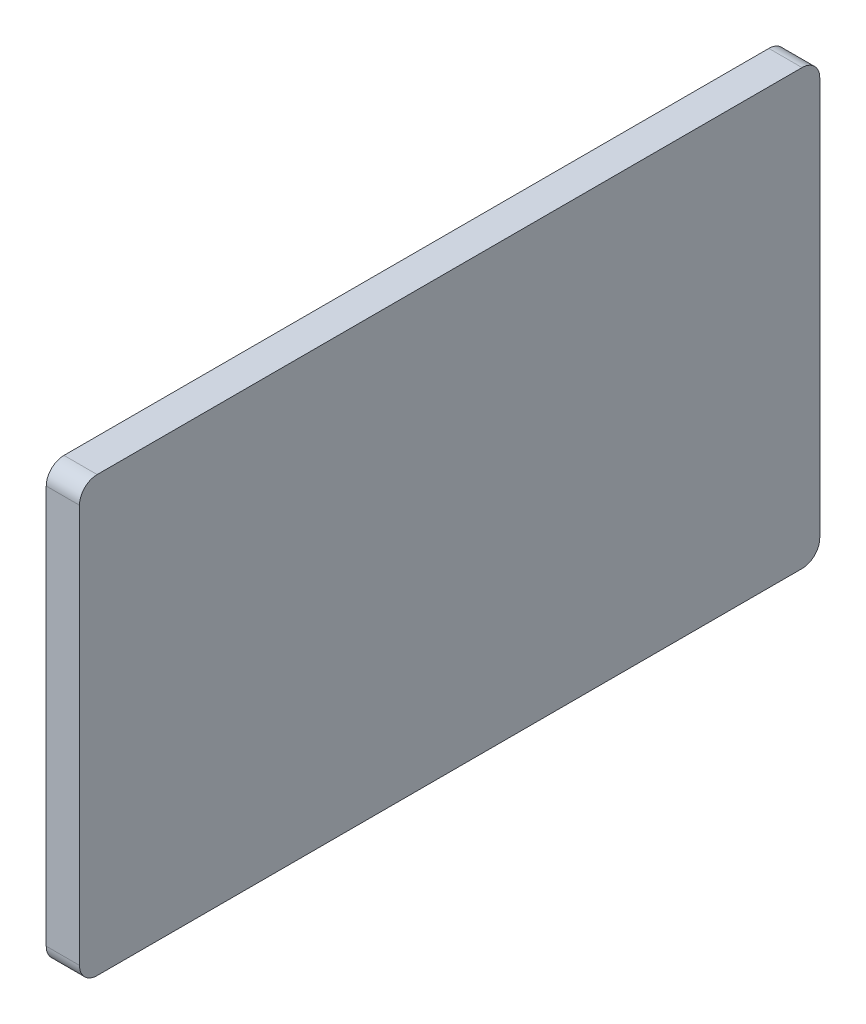
ISO-10303-21;
HEADER;
FILE_DESCRIPTION(('STEP AP214'),'2;1');
FILE_NAME('part.step','',(''),(''),'','','');
FILE_SCHEMA(('AUTOMOTIVE_DESIGN { 1 0 10303 214 1 1 1 1 }'));
ENDSEC;
DATA;
#1=APPLICATION_CONTEXT('core data for automotive mechanical design processes');
#2=APPLICATION_PROTOCOL_DEFINITION('international standard','automotive_design',2000,#1);
#3=PRODUCT_CONTEXT('',#1,'mechanical');
#4=PRODUCT('Part','Part','',(#3));
#5=PRODUCT_RELATED_PRODUCT_CATEGORY('part','',(#4));
#6=PRODUCT_DEFINITION_FORMATION('','',#4);
#7=PRODUCT_DEFINITION_CONTEXT('part definition',#1,'design');
#8=PRODUCT_DEFINITION('design','',#6,#7);
#9=PRODUCT_DEFINITION_SHAPE('','',#8);
#10=(LENGTH_UNIT() NAMED_UNIT(*) SI_UNIT(.MILLI.,.METRE.));
#11=(NAMED_UNIT(*) PLANE_ANGLE_UNIT() SI_UNIT($,.RADIAN.));
#12=(NAMED_UNIT(*) SI_UNIT($,.STERADIAN.) SOLID_ANGLE_UNIT());
#13=UNCERTAINTY_MEASURE_WITH_UNIT(LENGTH_MEASURE(1.E-05),#10,'distance_accuracy_value','');
#14=(GEOMETRIC_REPRESENTATION_CONTEXT(3) GLOBAL_UNCERTAINTY_ASSIGNED_CONTEXT((#13)) GLOBAL_UNIT_ASSIGNED_CONTEXT((#10,
#11,#12)) REPRESENTATION_CONTEXT('',''));
#15=CARTESIAN_POINT('',(0.,0.,0.));
#16=DIRECTION('',(0.,0.,1.));
#17=DIRECTION('',(1.,0.,0.));
#18=AXIS2_PLACEMENT_3D('',#15,#16,#17);
#19=CARTESIAN_POINT('',(9.525,-62.23,-106.172));
#20=DIRECTION('',(0.,0.,1.));
#21=DIRECTION('',(1.,0.,0.));
#22=AXIS2_PLACEMENT_3D('',#19,#20,#21);
#23=PLANE('',#22);
#24=DIRECTION('',(0.,1.,0.));
#25=VECTOR('',#24,1.);
#26=CARTESIAN_POINT('',(9.525,-62.23,-106.172));
#27=LINE('',#26,#25);
#28=CARTESIAN_POINT('',(9.525,-57.15,-106.172));
#29=VERTEX_POINT('',#28);
#30=CARTESIAN_POINT('',(9.525,57.15,-106.172));
#31=VERTEX_POINT('',#30);
#32=EDGE_CURVE('E131',#29,#31,#27,.T.);
#33=ORIENTED_EDGE('',*,*,#32,.F.);
#34=DIRECTION('',(-1.,0.,0.));
#35=VECTOR('',#34,1.);
#36=CARTESIAN_POINT('',(9.525,-57.15,-106.172));
#37=LINE('',#36,#35);
#38=CARTESIAN_POINT('',(0.,-57.15,-106.172));
#39=VERTEX_POINT('',#38);
#40=EDGE_CURVE('E115',#29,#39,#37,.T.);
#41=ORIENTED_EDGE('',*,*,#40,.T.);
#42=DIRECTION('',(0.,1.,0.));
#43=VECTOR('',#42,1.);
#44=CARTESIAN_POINT('',(0.,-62.23,-106.172));
#45=LINE('',#44,#43);
#46=CARTESIAN_POINT('',(0.,57.15,-106.172));
#47=VERTEX_POINT('',#46);
#48=EDGE_CURVE('E128',#39,#47,#45,.T.);
#49=ORIENTED_EDGE('',*,*,#48,.T.);
#50=DIRECTION('',(-1.,0.,0.));
#51=VECTOR('',#50,1.);
#52=CARTESIAN_POINT('',(9.525,57.15,-106.172));
#53=LINE('',#52,#51);
#54=EDGE_CURVE('E134',#47,#31,#53,.F.);
#55=ORIENTED_EDGE('',*,*,#54,.T.);
#56=EDGE_LOOP('',(#33,#41,#49,#55));
#57=FACE_BOUND('',#56,.T.);
#58=ADVANCED_FACE('F43',(#57),#23,.F.);
#59=CARTESIAN_POINT('',(9.525,62.23,106.172));
#60=DIRECTION('',(0.,-1.,0.));
#61=DIRECTION('',(0.,0.,-1.));
#62=AXIS2_PLACEMENT_3D('',#59,#60,#61);
#63=PLANE('',#62);
#64=DIRECTION('',(0.,0.,1.));
#65=VECTOR('',#64,1.);
#66=CARTESIAN_POINT('',(9.525,62.23,106.172));
#67=LINE('',#66,#65);
#68=CARTESIAN_POINT('',(9.525,62.23,-101.092));
#69=VERTEX_POINT('',#68);
#70=CARTESIAN_POINT('',(9.525,62.23,101.092));
#71=VERTEX_POINT('',#70);
#72=EDGE_CURVE('E189',#69,#71,#67,.T.);
#73=ORIENTED_EDGE('',*,*,#72,.F.);
#74=DIRECTION('',(-1.,0.,0.));
#75=VECTOR('',#74,1.);
#76=CARTESIAN_POINT('',(9.525,62.23,-101.092));
#77=LINE('',#76,#75);
#78=CARTESIAN_POINT('',(0.,62.23,-101.092));
#79=VERTEX_POINT('',#78);
#80=EDGE_CURVE('E11',#69,#79,#77,.T.);
#81=ORIENTED_EDGE('',*,*,#80,.T.);
#82=DIRECTION('',(0.,0.,1.));
#83=VECTOR('',#82,1.);
#84=CARTESIAN_POINT('',(0.,62.23,106.172));
#85=LINE('',#84,#83);
#86=CARTESIAN_POINT('',(0.,62.23,101.092));
#87=VERTEX_POINT('',#86);
#88=EDGE_CURVE('E140',#79,#87,#85,.T.);
#89=ORIENTED_EDGE('',*,*,#88,.T.);
#90=DIRECTION('',(-1.,0.,0.));
#91=VECTOR('',#90,1.);
#92=CARTESIAN_POINT('',(9.525,62.23,101.092));
#93=LINE('',#92,#91);
#94=EDGE_CURVE('E52',#87,#71,#93,.F.);
#95=ORIENTED_EDGE('',*,*,#94,.T.);
#96=EDGE_LOOP('',(#73,#81,#89,#95));
#97=FACE_BOUND('',#96,.T.);
#98=ADVANCED_FACE('F188',(#97),#63,.F.);
#99=CARTESIAN_POINT('',(9.525,-62.23,106.172));
#100=DIRECTION('',(0.,0.,-1.));
#101=DIRECTION('',(-1.,0.,0.));
#102=AXIS2_PLACEMENT_3D('',#99,#100,#101);
#103=PLANE('',#102);
#104=DIRECTION('',(0.,-1.,0.));
#105=VECTOR('',#104,1.);
#106=CARTESIAN_POINT('',(0.,-62.23,106.172));
#107=LINE('',#106,#105);
#108=CARTESIAN_POINT('',(0.,57.15,106.172));
#109=VERTEX_POINT('',#108);
#110=CARTESIAN_POINT('',(0.,-57.15,106.172));
#111=VERTEX_POINT('',#110);
#112=EDGE_CURVE('E144',#109,#111,#107,.T.);
#113=ORIENTED_EDGE('',*,*,#112,.T.);
#114=DIRECTION('',(-1.,0.,0.));
#115=VECTOR('',#114,1.);
#116=CARTESIAN_POINT('',(9.525,-57.15,106.172));
#117=LINE('',#116,#115);
#118=CARTESIAN_POINT('',(9.525,-57.15,106.172));
#119=VERTEX_POINT('',#118);
#120=EDGE_CURVE('E59',#111,#119,#117,.F.);
#121=ORIENTED_EDGE('',*,*,#120,.T.);
#122=DIRECTION('',(0.,-1.,0.));
#123=VECTOR('',#122,1.);
#124=CARTESIAN_POINT('',(9.525,-62.23,106.172));
#125=LINE('',#124,#123);
#126=CARTESIAN_POINT('',(9.525,57.15,106.172));
#127=VERTEX_POINT('',#126);
#128=EDGE_CURVE('E196',#127,#119,#125,.T.);
#129=ORIENTED_EDGE('',*,*,#128,.F.);
#130=DIRECTION('',(-1.,0.,0.));
#131=VECTOR('',#130,1.);
#132=CARTESIAN_POINT('',(9.525,57.15,106.172));
#133=LINE('',#132,#131);
#134=EDGE_CURVE('E179',#127,#109,#133,.T.);
#135=ORIENTED_EDGE('',*,*,#134,.T.);
#136=EDGE_LOOP('',(#113,#121,#129,#135));
#137=FACE_BOUND('',#136,.T.);
#138=ADVANCED_FACE('F200',(#137),#103,.F.);
#139=CARTESIAN_POINT('',(9.525,-62.23,106.172));
#140=DIRECTION('',(0.,1.,0.));
#141=DIRECTION('',(0.,0.,1.));
#142=AXIS2_PLACEMENT_3D('',#139,#140,#141);
#143=PLANE('',#142);
#144=DIRECTION('',(0.,0.,-1.));
#145=VECTOR('',#144,1.);
#146=CARTESIAN_POINT('',(0.,-62.23,106.172));
#147=LINE('',#146,#145);
#148=CARTESIAN_POINT('',(0.,-62.23,101.092));
#149=VERTEX_POINT('',#148);
#150=CARTESIAN_POINT('',(0.,-62.23,-101.092));
#151=VERTEX_POINT('',#150);
#152=EDGE_CURVE('E152',#149,#151,#147,.T.);
#153=ORIENTED_EDGE('',*,*,#152,.T.);
#154=DIRECTION('',(-1.,0.,0.));
#155=VECTOR('',#154,1.);
#156=CARTESIAN_POINT('',(9.525,-62.23,-101.092));
#157=LINE('',#156,#155);
#158=CARTESIAN_POINT('',(9.525,-62.23,-101.092));
#159=VERTEX_POINT('',#158);
#160=EDGE_CURVE('E116',#151,#159,#157,.F.);
#161=ORIENTED_EDGE('',*,*,#160,.T.);
#162=DIRECTION('',(0.,0.,-1.));
#163=VECTOR('',#162,1.);
#164=CARTESIAN_POINT('',(9.525,-62.23,106.172));
#165=LINE('',#164,#163);
#166=CARTESIAN_POINT('',(9.525,-62.23,101.092));
#167=VERTEX_POINT('',#166);
#168=EDGE_CURVE('E147',#167,#159,#165,.T.);
#169=ORIENTED_EDGE('',*,*,#168,.F.);
#170=DIRECTION('',(-1.,0.,0.));
#171=VECTOR('',#170,1.);
#172=CARTESIAN_POINT('',(9.525,-62.23,101.092));
#173=LINE('',#172,#171);
#174=EDGE_CURVE('E122',#167,#149,#173,.T.);
#175=ORIENTED_EDGE('',*,*,#174,.T.);
#176=EDGE_LOOP('',(#153,#161,#169,#175));
#177=FACE_BOUND('',#176,.T.);
#178=ADVANCED_FACE('F207',(#177),#143,.F.);
#179=CARTESIAN_POINT('',(9.525,0.,0.));
#180=DIRECTION('',(-1.,0.,0.));
#181=DIRECTION('',(0.,0.,1.));
#182=AXIS2_PLACEMENT_3D('',#179,#180,#181);
#183=PLANE('',#182);
#184=ORIENTED_EDGE('',*,*,#168,.T.);
#185=CARTESIAN_POINT('',(9.525,-57.15,-101.092));
#186=DIRECTION('',(-1.,0.,0.));
#187=DIRECTION('',(0.,0.,1.));
#188=AXIS2_PLACEMENT_3D('',#185,#186,#187);
#189=CIRCLE('',#188,5.08);
#190=EDGE_CURVE('E176',#159,#29,#189,.F.);
#191=ORIENTED_EDGE('',*,*,#190,.T.);
#192=ORIENTED_EDGE('',*,*,#32,.T.);
#193=CARTESIAN_POINT('',(9.525,57.15,-101.092));
#194=DIRECTION('',(-1.,0.,0.));
#195=DIRECTION('',(0.,0.,1.));
#196=AXIS2_PLACEMENT_3D('',#193,#194,#195);
#197=CIRCLE('',#196,5.08);
#198=EDGE_CURVE('E170',#31,#69,#197,.F.);
#199=ORIENTED_EDGE('',*,*,#198,.T.);
#200=ORIENTED_EDGE('',*,*,#72,.T.);
#201=CARTESIAN_POINT('',(9.525,57.15,101.092));
#202=DIRECTION('',(-1.,0.,0.));
#203=DIRECTION('',(0.,0.,1.));
#204=AXIS2_PLACEMENT_3D('',#201,#202,#203);
#205=CIRCLE('',#204,5.08);
#206=EDGE_CURVE('E66',#71,#127,#205,.F.);
#207=ORIENTED_EDGE('',*,*,#206,.T.);
#208=ORIENTED_EDGE('',*,*,#128,.T.);
#209=CARTESIAN_POINT('',(9.525,-57.15,101.092));
#210=DIRECTION('',(-1.,0.,0.));
#211=DIRECTION('',(0.,0.,1.));
#212=AXIS2_PLACEMENT_3D('',#209,#210,#211);
#213=CIRCLE('',#212,5.08);
#214=EDGE_CURVE('E173',#119,#167,#213,.F.);
#215=ORIENTED_EDGE('',*,*,#214,.T.);
#216=EDGE_LOOP('',(#184,#191,#192,#199,#200,#207,#208,#215));
#217=FACE_BOUND('',#216,.T.);
#218=ADVANCED_FACE('F193',(#217),#183,.F.);
#219=CARTESIAN_POINT('',(0.,0.,0.));
#220=DIRECTION('',(-1.,0.,0.));
#221=DIRECTION('',(0.,0.,1.));
#222=AXIS2_PLACEMENT_3D('',#219,#220,#221);
#223=PLANE('',#222);
#224=ORIENTED_EDGE('',*,*,#48,.F.);
#225=CARTESIAN_POINT('',(0.,-57.15,-101.092));
#226=DIRECTION('',(-1.,0.,0.));
#227=DIRECTION('',(0.,0.,1.));
#228=AXIS2_PLACEMENT_3D('',#225,#226,#227);
#229=CIRCLE('',#228,5.08);
#230=EDGE_CURVE('E111',#39,#151,#229,.T.);
#231=ORIENTED_EDGE('',*,*,#230,.T.);
#232=ORIENTED_EDGE('',*,*,#152,.F.);
#233=CARTESIAN_POINT('',(0.,-57.15,101.092));
#234=DIRECTION('',(-1.,0.,0.));
#235=DIRECTION('',(0.,0.,1.));
#236=AXIS2_PLACEMENT_3D('',#233,#234,#235);
#237=CIRCLE('',#236,5.08);
#238=EDGE_CURVE('E123',#149,#111,#237,.T.);
#239=ORIENTED_EDGE('',*,*,#238,.T.);
#240=ORIENTED_EDGE('',*,*,#112,.F.);
#241=CARTESIAN_POINT('',(0.,57.15,101.092));
#242=DIRECTION('',(-1.,0.,0.));
#243=DIRECTION('',(0.,0.,1.));
#244=AXIS2_PLACEMENT_3D('',#241,#242,#243);
#245=CIRCLE('',#244,5.08);
#246=EDGE_CURVE('E133',#109,#87,#245,.T.);
#247=ORIENTED_EDGE('',*,*,#246,.T.);
#248=ORIENTED_EDGE('',*,*,#88,.F.);
#249=CARTESIAN_POINT('',(0.,57.15,-101.092));
#250=DIRECTION('',(-1.,0.,0.));
#251=DIRECTION('',(0.,0.,1.));
#252=AXIS2_PLACEMENT_3D('',#249,#250,#251);
#253=CIRCLE('',#252,5.08);
#254=EDGE_CURVE('E138',#79,#47,#253,.T.);
#255=ORIENTED_EDGE('',*,*,#254,.T.);
#256=EDGE_LOOP('',(#224,#231,#232,#239,#240,#247,#248,#255));
#257=FACE_BOUND('',#256,.T.);
#258=ADVANCED_FACE('F136',(#257),#223,.T.);
#259=CARTESIAN_POINT('',(9.525,-57.15,-101.092));
#260=DIRECTION('',(-1.,0.,0.));
#261=DIRECTION('',(0.,0.,1.));
#262=AXIS2_PLACEMENT_3D('',#259,#260,#261);
#263=CYLINDRICAL_SURFACE('',#262,5.08);
#264=ORIENTED_EDGE('',*,*,#190,.F.);
#265=ORIENTED_EDGE('',*,*,#160,.F.);
#266=ORIENTED_EDGE('',*,*,#230,.F.);
#267=ORIENTED_EDGE('',*,*,#40,.F.);
#268=EDGE_LOOP('',(#264,#265,#266,#267));
#269=FACE_BOUND('',#268,.T.);
#270=ADVANCED_FACE('F114',(#269),#263,.T.);
#271=CARTESIAN_POINT('',(9.525,-57.15,101.092));
#272=DIRECTION('',(-1.,0.,0.));
#273=DIRECTION('',(0.,0.,1.));
#274=AXIS2_PLACEMENT_3D('',#271,#272,#273);
#275=CYLINDRICAL_SURFACE('',#274,5.08);
#276=ORIENTED_EDGE('',*,*,#214,.F.);
#277=ORIENTED_EDGE('',*,*,#120,.F.);
#278=ORIENTED_EDGE('',*,*,#238,.F.);
#279=ORIENTED_EDGE('',*,*,#174,.F.);
#280=EDGE_LOOP('',(#276,#277,#278,#279));
#281=FACE_BOUND('',#280,.T.);
#282=ADVANCED_FACE('F204',(#281),#275,.T.);
#283=CARTESIAN_POINT('',(9.525,57.15,-101.092));
#284=DIRECTION('',(-1.,0.,0.));
#285=DIRECTION('',(0.,0.,1.));
#286=AXIS2_PLACEMENT_3D('',#283,#284,#285);
#287=CYLINDRICAL_SURFACE('',#286,5.08);
#288=ORIENTED_EDGE('',*,*,#198,.F.);
#289=ORIENTED_EDGE('',*,*,#54,.F.);
#290=ORIENTED_EDGE('',*,*,#254,.F.);
#291=ORIENTED_EDGE('',*,*,#80,.F.);
#292=EDGE_LOOP('',(#288,#289,#290,#291));
#293=FACE_BOUND('',#292,.T.);
#294=ADVANCED_FACE('F213',(#293),#287,.T.);
#295=CARTESIAN_POINT('',(9.525,57.15,101.092));
#296=DIRECTION('',(-1.,0.,0.));
#297=DIRECTION('',(0.,0.,1.));
#298=AXIS2_PLACEMENT_3D('',#295,#296,#297);
#299=CYLINDRICAL_SURFACE('',#298,5.08);
#300=ORIENTED_EDGE('',*,*,#206,.F.);
#301=ORIENTED_EDGE('',*,*,#94,.F.);
#302=ORIENTED_EDGE('',*,*,#246,.F.);
#303=ORIENTED_EDGE('',*,*,#134,.F.);
#304=EDGE_LOOP('',(#300,#301,#302,#303));
#305=FACE_BOUND('',#304,.T.);
#306=ADVANCED_FACE('F45',(#305),#299,.T.);
#307=CLOSED_SHELL('',(#58,#98,#138,#178,#218,#258,#270,#282,#294,#306));
#308=MANIFOLD_SOLID_BREP('B2',#307);
#309=ADVANCED_BREP_SHAPE_REPRESENTATION('',(#18,#308),#14);
#310=SHAPE_DEFINITION_REPRESENTATION(#9,#309);
ENDSEC;
END-ISO-10303-21;
